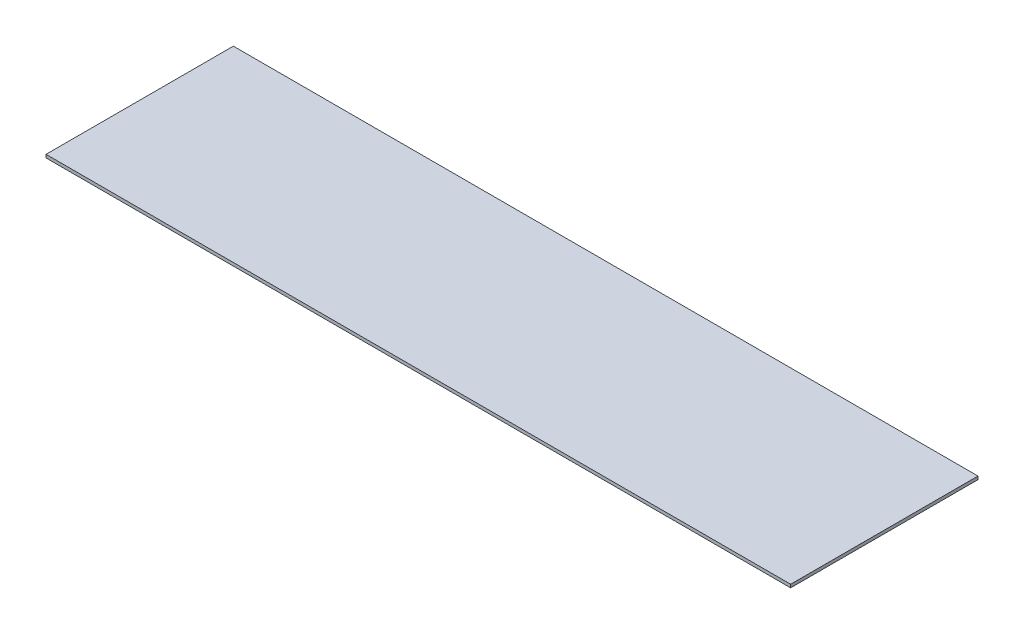
ISO-10303-21;
HEADER;
FILE_DESCRIPTION(('STEP AP214'),'2;1');
FILE_NAME('part.step','',(''),(''),'','','');
FILE_SCHEMA(('AUTOMOTIVE_DESIGN { 1 0 10303 214 1 1 1 1 }'));
ENDSEC;
DATA;
#1=APPLICATION_CONTEXT('core data for automotive mechanical design processes');
#2=APPLICATION_PROTOCOL_DEFINITION('international standard','automotive_design',2000,#1);
#3=PRODUCT_CONTEXT('',#1,'mechanical');
#4=PRODUCT('Part','Part','',(#3));
#5=PRODUCT_RELATED_PRODUCT_CATEGORY('part','',(#4));
#6=PRODUCT_DEFINITION_FORMATION('','',#4);
#7=PRODUCT_DEFINITION_CONTEXT('part definition',#1,'design');
#8=PRODUCT_DEFINITION('design','',#6,#7);
#9=PRODUCT_DEFINITION_SHAPE('','',#8);
#10=(LENGTH_UNIT() NAMED_UNIT(*) SI_UNIT(.MILLI.,.METRE.));
#11=(NAMED_UNIT(*) PLANE_ANGLE_UNIT() SI_UNIT($,.RADIAN.));
#12=(NAMED_UNIT(*) SI_UNIT($,.STERADIAN.) SOLID_ANGLE_UNIT());
#13=UNCERTAINTY_MEASURE_WITH_UNIT(LENGTH_MEASURE(1.E-05),#10,'distance_accuracy_value','');
#14=(GEOMETRIC_REPRESENTATION_CONTEXT(3) GLOBAL_UNCERTAINTY_ASSIGNED_CONTEXT((#13)) GLOBAL_UNIT_ASSIGNED_CONTEXT((#10,
#11,#12)) REPRESENTATION_CONTEXT('',''));
#15=CARTESIAN_POINT('',(0.,0.,0.));
#16=DIRECTION('',(0.,0.,1.));
#17=DIRECTION('',(1.,0.,0.));
#18=AXIS2_PLACEMENT_3D('',#15,#16,#17);
#19=CARTESIAN_POINT('',(-1069.,9.,269.));
#20=DIRECTION('',(1.,0.,0.));
#21=DIRECTION('',(0.,0.,-1.));
#22=AXIS2_PLACEMENT_3D('',#19,#20,#21);
#23=PLANE('',#22);
#24=DIRECTION('',(0.,0.,1.));
#25=VECTOR('',#24,1.);
#26=CARTESIAN_POINT('',(-1069.,0.,269.));
#27=LINE('',#26,#25);
#28=CARTESIAN_POINT('',(-1069.,0.,-269.));
#29=VERTEX_POINT('',#28);
#30=CARTESIAN_POINT('',(-1069.,0.,269.));
#31=VERTEX_POINT('',#30);
#32=EDGE_CURVE('E98',#29,#31,#27,.T.);
#33=ORIENTED_EDGE('',*,*,#32,.T.);
#34=DIRECTION('',(0.,-1.,0.));
#35=VECTOR('',#34,1.);
#36=CARTESIAN_POINT('',(-1069.,9.,269.));
#37=LINE('',#36,#35);
#38=CARTESIAN_POINT('',(-1069.,9.,269.));
#39=VERTEX_POINT('',#38);
#40=EDGE_CURVE('E11',#39,#31,#37,.T.);
#41=ORIENTED_EDGE('',*,*,#40,.F.);
#42=DIRECTION('',(0.,0.,1.));
#43=VECTOR('',#42,1.);
#44=CARTESIAN_POINT('',(-1069.,9.,269.));
#45=LINE('',#44,#43);
#46=CARTESIAN_POINT('',(-1069.,9.,-269.));
#47=VERTEX_POINT('',#46);
#48=EDGE_CURVE('E86',#47,#39,#45,.T.);
#49=ORIENTED_EDGE('',*,*,#48,.F.);
#50=DIRECTION('',(0.,-1.,0.));
#51=VECTOR('',#50,1.);
#52=CARTESIAN_POINT('',(-1069.,9.,-269.));
#53=LINE('',#52,#51);
#54=EDGE_CURVE('E94',#47,#29,#53,.T.);
#55=ORIENTED_EDGE('',*,*,#54,.T.);
#56=EDGE_LOOP('',(#33,#41,#49,#55));
#57=FACE_BOUND('',#56,.T.);
#58=ADVANCED_FACE('F35',(#57),#23,.F.);
#59=CARTESIAN_POINT('',(1069.,9.,269.));
#60=DIRECTION('',(0.,0.,-1.));
#61=DIRECTION('',(-1.,0.,0.));
#62=AXIS2_PLACEMENT_3D('',#59,#60,#61);
#63=PLANE('',#62);
#64=DIRECTION('',(1.,0.,0.));
#65=VECTOR('',#64,1.);
#66=CARTESIAN_POINT('',(1069.,0.,269.));
#67=LINE('',#66,#65);
#68=CARTESIAN_POINT('',(1069.,0.,269.));
#69=VERTEX_POINT('',#68);
#70=EDGE_CURVE('E90',#31,#69,#67,.T.);
#71=ORIENTED_EDGE('',*,*,#70,.T.);
#72=DIRECTION('',(0.,-1.,0.));
#73=VECTOR('',#72,1.);
#74=CARTESIAN_POINT('',(1069.,9.,269.));
#75=LINE('',#74,#73);
#76=CARTESIAN_POINT('',(1069.,9.,269.));
#77=VERTEX_POINT('',#76);
#78=EDGE_CURVE('E43',#77,#69,#75,.T.);
#79=ORIENTED_EDGE('',*,*,#78,.F.);
#80=DIRECTION('',(1.,0.,0.));
#81=VECTOR('',#80,1.);
#82=CARTESIAN_POINT('',(1069.,9.,269.));
#83=LINE('',#82,#81);
#84=EDGE_CURVE('E81',#39,#77,#83,.T.);
#85=ORIENTED_EDGE('',*,*,#84,.F.);
#86=ORIENTED_EDGE('',*,*,#40,.T.);
#87=EDGE_LOOP('',(#71,#79,#85,#86));
#88=FACE_BOUND('',#87,.T.);
#89=ADVANCED_FACE('F89',(#88),#63,.F.);
#90=CARTESIAN_POINT('',(1069.,9.,269.));
#91=DIRECTION('',(-1.,0.,0.));
#92=DIRECTION('',(0.,0.,1.));
#93=AXIS2_PLACEMENT_3D('',#90,#91,#92);
#94=PLANE('',#93);
#95=DIRECTION('',(0.,0.,-1.));
#96=VECTOR('',#95,1.);
#97=CARTESIAN_POINT('',(1069.,0.,269.));
#98=LINE('',#97,#96);
#99=CARTESIAN_POINT('',(1069.,0.,-269.));
#100=VERTEX_POINT('',#99);
#101=EDGE_CURVE('E68',#69,#100,#98,.T.);
#102=ORIENTED_EDGE('',*,*,#101,.T.);
#103=DIRECTION('',(0.,-1.,0.));
#104=VECTOR('',#103,1.);
#105=CARTESIAN_POINT('',(1069.,9.,-269.));
#106=LINE('',#105,#104);
#107=CARTESIAN_POINT('',(1069.,9.,-269.));
#108=VERTEX_POINT('',#107);
#109=EDGE_CURVE('E91',#108,#100,#106,.T.);
#110=ORIENTED_EDGE('',*,*,#109,.F.);
#111=DIRECTION('',(0.,0.,-1.));
#112=VECTOR('',#111,1.);
#113=CARTESIAN_POINT('',(1069.,9.,269.));
#114=LINE('',#113,#112);
#115=EDGE_CURVE('E84',#77,#108,#114,.T.);
#116=ORIENTED_EDGE('',*,*,#115,.F.);
#117=ORIENTED_EDGE('',*,*,#78,.T.);
#118=EDGE_LOOP('',(#102,#110,#116,#117));
#119=FACE_BOUND('',#118,.T.);
#120=ADVANCED_FACE('F92',(#119),#94,.F.);
#121=CARTESIAN_POINT('',(1069.,9.,-269.));
#122=DIRECTION('',(0.,0.,1.));
#123=DIRECTION('',(1.,0.,0.));
#124=AXIS2_PLACEMENT_3D('',#121,#122,#123);
#125=PLANE('',#124);
#126=DIRECTION('',(-1.,0.,0.));
#127=VECTOR('',#126,1.);
#128=CARTESIAN_POINT('',(1069.,0.,-269.));
#129=LINE('',#128,#127);
#130=EDGE_CURVE('E74',#100,#29,#129,.T.);
#131=ORIENTED_EDGE('',*,*,#130,.T.);
#132=ORIENTED_EDGE('',*,*,#54,.F.);
#133=DIRECTION('',(-1.,0.,0.));
#134=VECTOR('',#133,1.);
#135=CARTESIAN_POINT('',(1069.,9.,-269.));
#136=LINE('',#135,#134);
#137=EDGE_CURVE('E51',#108,#47,#136,.T.);
#138=ORIENTED_EDGE('',*,*,#137,.F.);
#139=ORIENTED_EDGE('',*,*,#109,.T.);
#140=EDGE_LOOP('',(#131,#132,#138,#139));
#141=FACE_BOUND('',#140,.T.);
#142=ADVANCED_FACE('F105',(#141),#125,.F.);
#143=CARTESIAN_POINT('',(0.,9.,0.));
#144=DIRECTION('',(0.,1.,0.));
#145=DIRECTION('',(0.,0.,1.));
#146=AXIS2_PLACEMENT_3D('',#143,#144,#145);
#147=PLANE('',#146);
#148=ORIENTED_EDGE('',*,*,#48,.T.);
#149=ORIENTED_EDGE('',*,*,#84,.T.);
#150=ORIENTED_EDGE('',*,*,#115,.T.);
#151=ORIENTED_EDGE('',*,*,#137,.T.);
#152=EDGE_LOOP('',(#148,#149,#150,#151));
#153=FACE_BOUND('',#152,.T.);
#154=ADVANCED_FACE('F82',(#153),#147,.T.);
#155=CARTESIAN_POINT('',(0.,0.,0.));
#156=DIRECTION('',(0.,1.,0.));
#157=DIRECTION('',(0.,0.,1.));
#158=AXIS2_PLACEMENT_3D('',#155,#156,#157);
#159=PLANE('',#158);
#160=ORIENTED_EDGE('',*,*,#32,.F.);
#161=ORIENTED_EDGE('',*,*,#130,.F.);
#162=ORIENTED_EDGE('',*,*,#101,.F.);
#163=ORIENTED_EDGE('',*,*,#70,.F.);
#164=EDGE_LOOP('',(#160,#161,#162,#163));
#165=FACE_BOUND('',#164,.T.);
#166=ADVANCED_FACE('F108',(#165),#159,.F.);
#167=CLOSED_SHELL('',(#58,#89,#120,#142,#154,#166));
#168=MANIFOLD_SOLID_BREP('B2',#167);
#169=ADVANCED_BREP_SHAPE_REPRESENTATION('',(#18,#168),#14);
#170=SHAPE_DEFINITION_REPRESENTATION(#9,#169);
ENDSEC;
END-ISO-10303-21;
